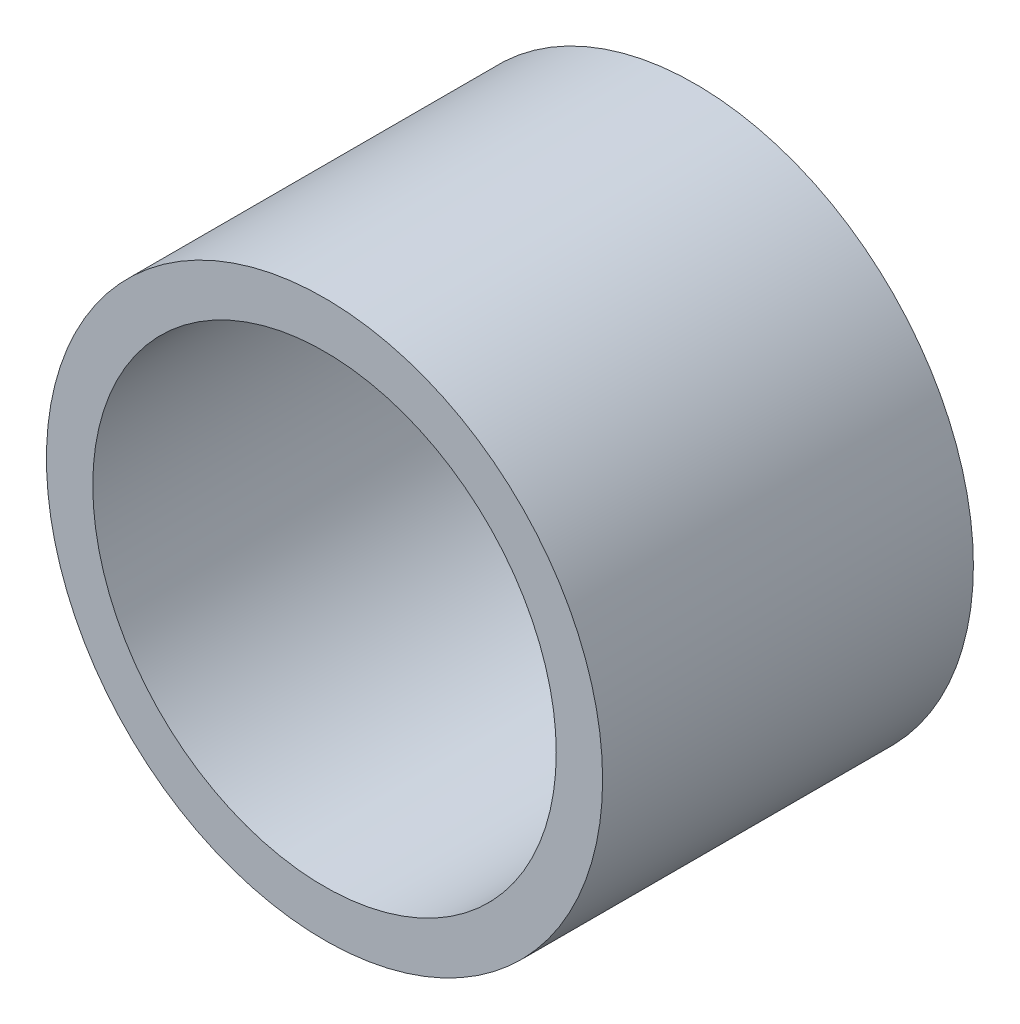
ISO-10303-21;
HEADER;
FILE_DESCRIPTION(('STEP AP214'),'2;1');
FILE_NAME('part.step','',(''),(''),'','','');
FILE_SCHEMA(('AUTOMOTIVE_DESIGN { 1 0 10303 214 1 1 1 1 }'));
ENDSEC;
DATA;
#1=APPLICATION_CONTEXT('core data for automotive mechanical design processes');
#2=APPLICATION_PROTOCOL_DEFINITION('international standard','automotive_design',2000,#1);
#3=PRODUCT_CONTEXT('',#1,'mechanical');
#4=PRODUCT('Part','Part','',(#3));
#5=PRODUCT_RELATED_PRODUCT_CATEGORY('part','',(#4));
#6=PRODUCT_DEFINITION_FORMATION('','',#4);
#7=PRODUCT_DEFINITION_CONTEXT('part definition',#1,'design');
#8=PRODUCT_DEFINITION('design','',#6,#7);
#9=PRODUCT_DEFINITION_SHAPE('','',#8);
#10=(LENGTH_UNIT() NAMED_UNIT(*) SI_UNIT(.MILLI.,.METRE.));
#11=(NAMED_UNIT(*) PLANE_ANGLE_UNIT() SI_UNIT($,.RADIAN.));
#12=(NAMED_UNIT(*) SI_UNIT($,.STERADIAN.) SOLID_ANGLE_UNIT());
#13=UNCERTAINTY_MEASURE_WITH_UNIT(LENGTH_MEASURE(1.E-05),#10,'distance_accuracy_value','');
#14=(GEOMETRIC_REPRESENTATION_CONTEXT(3) GLOBAL_UNCERTAINTY_ASSIGNED_CONTEXT((#13)) GLOBAL_UNIT_ASSIGNED_CONTEXT((#10,
#11,#12)) REPRESENTATION_CONTEXT('',''));
#15=CARTESIAN_POINT('',(0.,0.,0.));
#16=DIRECTION('',(0.,0.,1.));
#17=DIRECTION('',(1.,0.,0.));
#18=AXIS2_PLACEMENT_3D('',#15,#16,#17);
#19=CARTESIAN_POINT('',(0.,0.,50.8));
#20=DIRECTION('',(0.,0.,1.));
#21=DIRECTION('',(1.,0.,0.));
#22=AXIS2_PLACEMENT_3D('',#19,#20,#21);
#23=PLANE('',#22);
#24=CARTESIAN_POINT('',(0.,0.,50.8));
#25=DIRECTION('',(0.,0.,1.));
#26=DIRECTION('',(1.,0.,0.));
#27=AXIS2_PLACEMENT_3D('',#24,#25,#26);
#28=CIRCLE('',#27,38.1);
#29=CARTESIAN_POINT('',(38.1,0.,50.8));
#30=VERTEX_POINT('',#29);
#31=EDGE_CURVE('E10',#30,#30,#28,.T.);
#32=ORIENTED_EDGE('',*,*,#31,.T.);
#33=EDGE_LOOP('',(#32));
#34=FACE_BOUND('',#33,.T.);
#35=CARTESIAN_POINT('',(0.,0.,50.8));
#36=DIRECTION('',(0.,0.,1.));
#37=DIRECTION('',(1.,0.,0.));
#38=AXIS2_PLACEMENT_3D('',#35,#36,#37);
#39=CIRCLE('',#38,31.75);
#40=CARTESIAN_POINT('',(31.75,0.,50.8));
#41=VERTEX_POINT('',#40);
#42=EDGE_CURVE('E52',#41,#41,#39,.T.);
#43=ORIENTED_EDGE('',*,*,#42,.F.);
#44=EDGE_LOOP('',(#43));
#45=FACE_BOUND('',#44,.T.);
#46=ADVANCED_FACE('F39',(#34,#45),#23,.T.);
#47=CARTESIAN_POINT('',(0.,0.,0.));
#48=DIRECTION('',(0.,0.,1.));
#49=DIRECTION('',(1.,0.,0.));
#50=AXIS2_PLACEMENT_3D('',#47,#48,#49);
#51=PLANE('',#50);
#52=CARTESIAN_POINT('',(0.,0.,0.));
#53=DIRECTION('',(0.,0.,1.));
#54=DIRECTION('',(1.,0.,0.));
#55=AXIS2_PLACEMENT_3D('',#52,#53,#54);
#56=CIRCLE('',#55,38.1);
#57=CARTESIAN_POINT('',(38.1,0.,0.));
#58=VERTEX_POINT('',#57);
#59=EDGE_CURVE('E43',#58,#58,#56,.T.);
#60=ORIENTED_EDGE('',*,*,#59,.F.);
#61=EDGE_LOOP('',(#60));
#62=FACE_BOUND('',#61,.T.);
#63=CARTESIAN_POINT('',(0.,0.,0.));
#64=DIRECTION('',(0.,0.,1.));
#65=DIRECTION('',(1.,0.,0.));
#66=AXIS2_PLACEMENT_3D('',#63,#64,#65);
#67=CIRCLE('',#66,31.75);
#68=CARTESIAN_POINT('',(31.75,0.,0.));
#69=VERTEX_POINT('',#68);
#70=EDGE_CURVE('E54',#69,#69,#67,.T.);
#71=ORIENTED_EDGE('',*,*,#70,.T.);
#72=EDGE_LOOP('',(#71));
#73=FACE_BOUND('',#72,.T.);
#74=ADVANCED_FACE('F66',(#62,#73),#51,.F.);
#75=CARTESIAN_POINT('',(0.,0.,50.8));
#76=DIRECTION('',(0.,0.,-1.));
#77=DIRECTION('',(-1.,0.,0.));
#78=AXIS2_PLACEMENT_3D('',#75,#76,#77);
#79=CYLINDRICAL_SURFACE('',#78,38.1);
#80=ORIENTED_EDGE('',*,*,#31,.F.);
#81=EDGE_LOOP('',(#80));
#82=FACE_BOUND('',#81,.T.);
#83=ORIENTED_EDGE('',*,*,#59,.T.);
#84=EDGE_LOOP('',(#83));
#85=FACE_BOUND('',#84,.T.);
#86=ADVANCED_FACE('F41',(#82,#85),#79,.T.);
#87=CARTESIAN_POINT('',(0.,0.,50.8));
#88=DIRECTION('',(0.,0.,-1.));
#89=DIRECTION('',(-1.,0.,0.));
#90=AXIS2_PLACEMENT_3D('',#87,#88,#89);
#91=CYLINDRICAL_SURFACE('',#90,31.75);
#92=ORIENTED_EDGE('',*,*,#42,.T.);
#93=EDGE_LOOP('',(#92));
#94=FACE_BOUND('',#93,.T.);
#95=ORIENTED_EDGE('',*,*,#70,.F.);
#96=EDGE_LOOP('',(#95));
#97=FACE_BOUND('',#96,.T.);
#98=ADVANCED_FACE('F62',(#94,#97),#91,.F.);
#99=CLOSED_SHELL('',(#46,#74,#86,#98));
#100=MANIFOLD_SOLID_BREP('B2',#99);
#101=ADVANCED_BREP_SHAPE_REPRESENTATION('',(#18,#100),#14);
#102=SHAPE_DEFINITION_REPRESENTATION(#9,#101);
ENDSEC;
END-ISO-10303-21;
